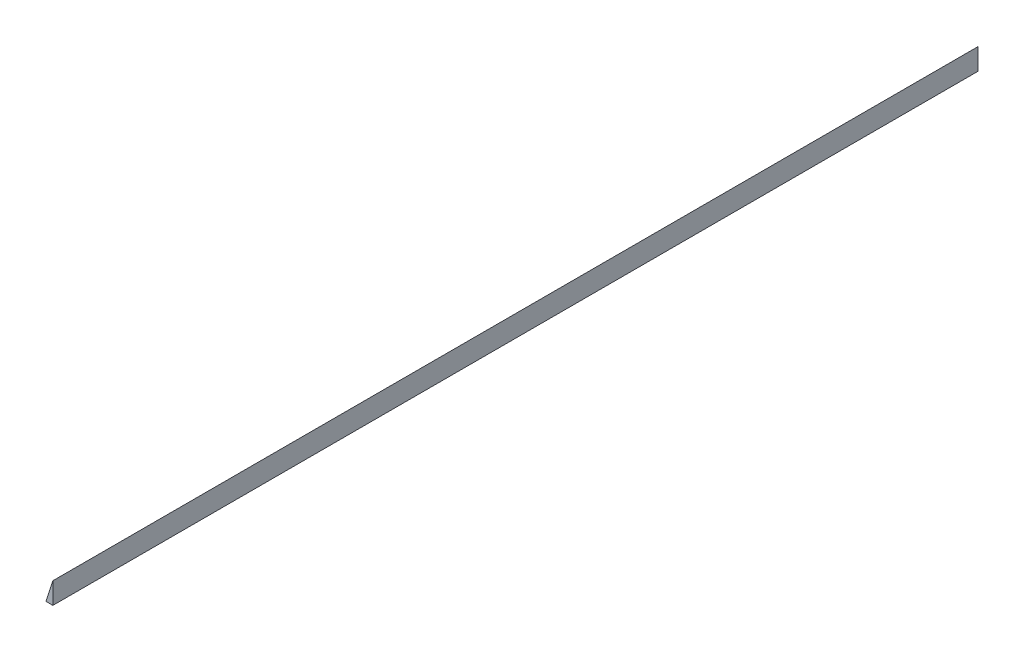
ISO-10303-21;
HEADER;
FILE_DESCRIPTION(('STEP AP214'),'2;1');
FILE_NAME('part.step','',(''),(''),'','','');
FILE_SCHEMA(('AUTOMOTIVE_DESIGN { 1 0 10303 214 1 1 1 1 }'));
ENDSEC;
DATA;
#1=APPLICATION_CONTEXT('core data for automotive mechanical design processes');
#2=APPLICATION_PROTOCOL_DEFINITION('international standard','automotive_design',2000,#1);
#3=PRODUCT_CONTEXT('',#1,'mechanical');
#4=PRODUCT('Part','Part','',(#3));
#5=PRODUCT_RELATED_PRODUCT_CATEGORY('part','',(#4));
#6=PRODUCT_DEFINITION_FORMATION('','',#4);
#7=PRODUCT_DEFINITION_CONTEXT('part definition',#1,'design');
#8=PRODUCT_DEFINITION('design','',#6,#7);
#9=PRODUCT_DEFINITION_SHAPE('','',#8);
#10=(LENGTH_UNIT() NAMED_UNIT(*) SI_UNIT(.MILLI.,.METRE.));
#11=(NAMED_UNIT(*) PLANE_ANGLE_UNIT() SI_UNIT($,.RADIAN.));
#12=(NAMED_UNIT(*) SI_UNIT($,.STERADIAN.) SOLID_ANGLE_UNIT());
#13=UNCERTAINTY_MEASURE_WITH_UNIT(LENGTH_MEASURE(1.E-05),#10,'distance_accuracy_value','');
#14=(GEOMETRIC_REPRESENTATION_CONTEXT(3) GLOBAL_UNCERTAINTY_ASSIGNED_CONTEXT((#13)) GLOBAL_UNIT_ASSIGNED_CONTEXT((#10,
#11,#12)) REPRESENTATION_CONTEXT('',''));
#15=CARTESIAN_POINT('',(0.,0.,0.));
#16=DIRECTION('',(0.,0.,1.));
#17=DIRECTION('',(1.,0.,0.));
#18=AXIS2_PLACEMENT_3D('',#15,#16,#17);
#19=CARTESIAN_POINT('',(1.53049011757672,0.,206.));
#20=DIRECTION('',(0.,1.,0.));
#21=DIRECTION('',(0.,0.,1.));
#22=AXIS2_PLACEMENT_3D('',#19,#20,#21);
#23=PLANE('',#22);
#24=DIRECTION('',(1.,0.,0.));
#25=VECTOR('',#24,1.);
#26=CARTESIAN_POINT('',(1.53049011757672,0.,0.));
#27=LINE('',#26,#25);
#28=CARTESIAN_POINT('',(0.,0.,0.));
#29=VERTEX_POINT('',#28);
#30=CARTESIAN_POINT('',(1.53049011757672,0.,0.));
#31=VERTEX_POINT('',#30);
#32=EDGE_CURVE('E89',#29,#31,#27,.T.);
#33=ORIENTED_EDGE('',*,*,#32,.T.);
#34=DIRECTION('',(0.,0.,-1.));
#35=VECTOR('',#34,1.);
#36=CARTESIAN_POINT('',(1.53049011757672,0.,206.));
#37=LINE('',#36,#35);
#38=CARTESIAN_POINT('',(1.53049011757672,0.,206.));
#39=VERTEX_POINT('',#38);
#40=EDGE_CURVE('E11',#39,#31,#37,.T.);
#41=ORIENTED_EDGE('',*,*,#40,.F.);
#42=DIRECTION('',(1.,0.,0.));
#43=VECTOR('',#42,1.);
#44=CARTESIAN_POINT('',(1.53049011757672,0.,206.));
#45=LINE('',#44,#43);
#46=CARTESIAN_POINT('',(0.,0.,206.));
#47=VERTEX_POINT('',#46);
#48=EDGE_CURVE('E81',#47,#39,#45,.T.);
#49=ORIENTED_EDGE('',*,*,#48,.F.);
#50=DIRECTION('',(0.,0.,-1.));
#51=VECTOR('',#50,1.);
#52=CARTESIAN_POINT('',(0.,0.,206.));
#53=LINE('',#52,#51);
#54=EDGE_CURVE('E90',#47,#29,#53,.T.);
#55=ORIENTED_EDGE('',*,*,#54,.T.);
#56=EDGE_LOOP('',(#33,#41,#49,#55));
#57=FACE_BOUND('',#56,.T.);
#58=ADVANCED_FACE('F39',(#57),#23,.F.);
#59=CARTESIAN_POINT('',(1.53049011757672,4.76,206.));
#60=DIRECTION('',(-1.,0.,0.));
#61=DIRECTION('',(0.,-1.,0.));
#62=AXIS2_PLACEMENT_3D('',#59,#60,#61);
#63=PLANE('',#62);
#64=DIRECTION('',(0.,1.,0.));
#65=VECTOR('',#64,1.);
#66=CARTESIAN_POINT('',(1.53049011757672,4.76,0.));
#67=LINE('',#66,#65);
#68=CARTESIAN_POINT('',(1.53049011757672,4.76,0.));
#69=VERTEX_POINT('',#68);
#70=EDGE_CURVE('E68',#31,#69,#67,.T.);
#71=ORIENTED_EDGE('',*,*,#70,.T.);
#72=DIRECTION('',(0.,0.,-1.));
#73=VECTOR('',#72,1.);
#74=CARTESIAN_POINT('',(1.53049011757672,4.76,206.));
#75=LINE('',#74,#73);
#76=CARTESIAN_POINT('',(1.53049011757672,4.76,206.));
#77=VERTEX_POINT('',#76);
#78=EDGE_CURVE('E48',#77,#69,#75,.T.);
#79=ORIENTED_EDGE('',*,*,#78,.F.);
#80=DIRECTION('',(0.,1.,0.));
#81=VECTOR('',#80,1.);
#82=CARTESIAN_POINT('',(1.53049011757672,4.76,206.));
#83=LINE('',#82,#81);
#84=EDGE_CURVE('E76',#39,#77,#83,.T.);
#85=ORIENTED_EDGE('',*,*,#84,.F.);
#86=ORIENTED_EDGE('',*,*,#40,.T.);
#87=EDGE_LOOP('',(#71,#79,#85,#86));
#88=FACE_BOUND('',#87,.T.);
#89=ADVANCED_FACE('F77',(#88),#63,.F.);
#90=CARTESIAN_POINT('',(0.,0.,206.));
#91=DIRECTION('',(0.952,-0.306098023515344,0.));
#92=DIRECTION('',(0.306098023515344,0.952,0.));
#93=AXIS2_PLACEMENT_3D('',#90,#91,#92);
#94=PLANE('',#93);
#95=DIRECTION('',(-0.306098023515344,-0.952,0.));
#96=VECTOR('',#95,1.);
#97=CARTESIAN_POINT('',(0.,0.,0.));
#98=LINE('',#97,#96);
#99=EDGE_CURVE('E73',#69,#29,#98,.T.);
#100=ORIENTED_EDGE('',*,*,#99,.T.);
#101=ORIENTED_EDGE('',*,*,#54,.F.);
#102=DIRECTION('',(-0.306098023515344,-0.952,0.));
#103=VECTOR('',#102,1.);
#104=CARTESIAN_POINT('',(0.,0.,206.));
#105=LINE('',#104,#103);
#106=EDGE_CURVE('E56',#77,#47,#105,.T.);
#107=ORIENTED_EDGE('',*,*,#106,.F.);
#108=ORIENTED_EDGE('',*,*,#78,.T.);
#109=EDGE_LOOP('',(#100,#101,#107,#108));
#110=FACE_BOUND('',#109,.T.);
#111=ADVANCED_FACE('F102',(#110),#94,.F.);
#112=CARTESIAN_POINT('',(0.,0.,206.));
#113=DIRECTION('',(0.,0.,1.));
#114=DIRECTION('',(1.,0.,0.));
#115=AXIS2_PLACEMENT_3D('',#112,#113,#114);
#116=PLANE('',#115);
#117=ORIENTED_EDGE('',*,*,#48,.T.);
#118=ORIENTED_EDGE('',*,*,#84,.T.);
#119=ORIENTED_EDGE('',*,*,#106,.T.);
#120=EDGE_LOOP('',(#117,#118,#119));
#121=FACE_BOUND('',#120,.T.);
#122=ADVANCED_FACE('F84',(#121),#116,.T.);
#123=CARTESIAN_POINT('',(0.,0.,0.));
#124=DIRECTION('',(0.,0.,1.));
#125=DIRECTION('',(1.,0.,0.));
#126=AXIS2_PLACEMENT_3D('',#123,#124,#125);
#127=PLANE('',#126);
#128=ORIENTED_EDGE('',*,*,#32,.F.);
#129=ORIENTED_EDGE('',*,*,#99,.F.);
#130=ORIENTED_EDGE('',*,*,#70,.F.);
#131=EDGE_LOOP('',(#128,#129,#130));
#132=FACE_BOUND('',#131,.T.);
#133=ADVANCED_FACE('F103',(#132),#127,.F.);
#134=CLOSED_SHELL('',(#58,#89,#111,#122,#133));
#135=MANIFOLD_SOLID_BREP('B2',#134);
#136=ADVANCED_BREP_SHAPE_REPRESENTATION('',(#18,#135),#14);
#137=SHAPE_DEFINITION_REPRESENTATION(#9,#136);
ENDSEC;
END-ISO-10303-21;
